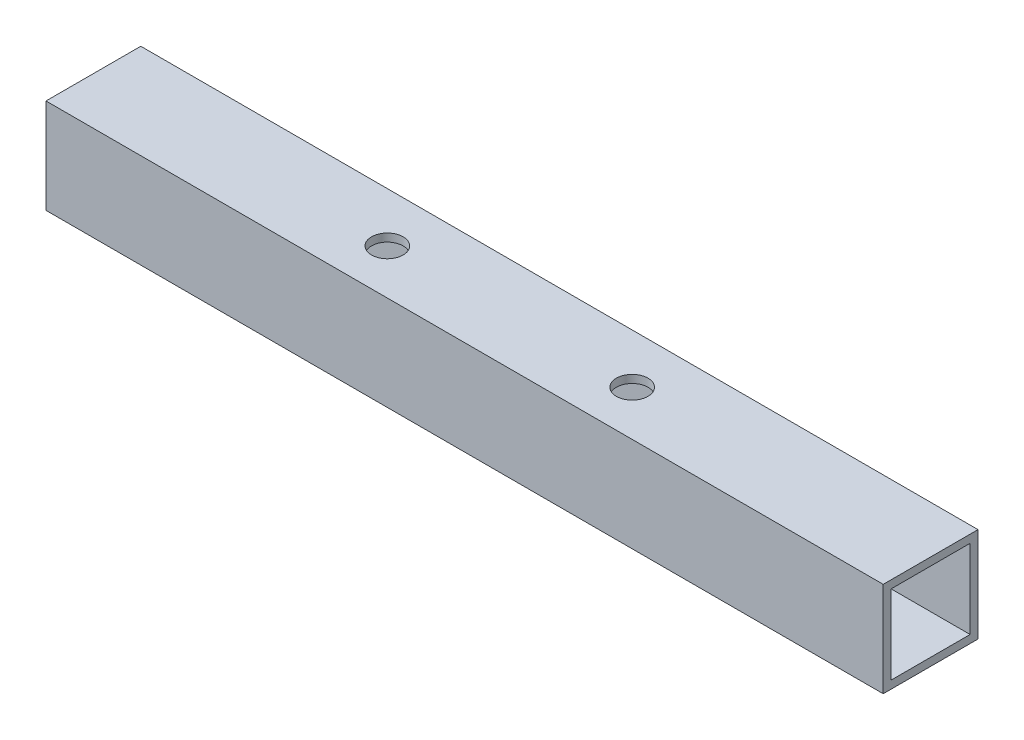
ISO-10303-21;
HEADER;
FILE_DESCRIPTION(('STEP AP214'),'2;1');
FILE_NAME('part.step','',(''),(''),'','','');
FILE_SCHEMA(('AUTOMOTIVE_DESIGN { 1 0 10303 214 1 1 1 1 }'));
ENDSEC;
DATA;
#1=APPLICATION_CONTEXT('core data for automotive mechanical design processes');
#2=APPLICATION_PROTOCOL_DEFINITION('international standard','automotive_design',2000,#1);
#3=PRODUCT_CONTEXT('',#1,'mechanical');
#4=PRODUCT('Part','Part','',(#3));
#5=PRODUCT_RELATED_PRODUCT_CATEGORY('part','',(#4));
#6=PRODUCT_DEFINITION_FORMATION('','',#4);
#7=PRODUCT_DEFINITION_CONTEXT('part definition',#1,'design');
#8=PRODUCT_DEFINITION('design','',#6,#7);
#9=PRODUCT_DEFINITION_SHAPE('','',#8);
#10=(LENGTH_UNIT() NAMED_UNIT(*) SI_UNIT(.MILLI.,.METRE.));
#11=(NAMED_UNIT(*) PLANE_ANGLE_UNIT() SI_UNIT($,.RADIAN.));
#12=(NAMED_UNIT(*) SI_UNIT($,.STERADIAN.) SOLID_ANGLE_UNIT());
#13=UNCERTAINTY_MEASURE_WITH_UNIT(LENGTH_MEASURE(1.E-05),#10,'distance_accuracy_value','');
#14=(GEOMETRIC_REPRESENTATION_CONTEXT(3) GLOBAL_UNCERTAINTY_ASSIGNED_CONTEXT((#13)) GLOBAL_UNIT_ASSIGNED_CONTEXT((#10,
#11,#12)) REPRESENTATION_CONTEXT('',''));
#15=CARTESIAN_POINT('',(0.,0.,0.));
#16=DIRECTION('',(0.,0.,1.));
#17=DIRECTION('',(1.,0.,0.));
#18=AXIS2_PLACEMENT_3D('',#15,#16,#17);
#19=CARTESIAN_POINT('',(15.5,-6.,6.2822585705839));
#20=DIRECTION('',(0.,1.,0.));
#21=DIRECTION('',(0.,0.,1.));
#22=AXIS2_PLACEMENT_3D('',#19,#20,#21);
#23=CYLINDRICAL_SURFACE('',#22,2.);
#24=CARTESIAN_POINT('',(15.5,-5.,6.2822585705839));
#25=DIRECTION('',(0.,-1.,0.));
#26=DIRECTION('',(0.,0.,-1.));
#27=AXIS2_PLACEMENT_3D('',#24,#25,#26);
#28=CIRCLE('',#27,2.);
#29=CARTESIAN_POINT('',(15.5,-5.,4.2822585705839));
#30=VERTEX_POINT('',#29);
#31=EDGE_CURVE('E136',#30,#30,#28,.F.);
#32=ORIENTED_EDGE('',*,*,#31,.T.);
#33=EDGE_LOOP('',(#32));
#34=FACE_BOUND('',#33,.T.);
#35=CARTESIAN_POINT('',(15.5,-6.,6.2822585705839));
#36=DIRECTION('',(0.,1.,0.));
#37=DIRECTION('',(0.,0.,-1.));
#38=AXIS2_PLACEMENT_3D('',#35,#36,#37);
#39=CIRCLE('',#38,2.);
#40=CARTESIAN_POINT('',(15.5,-6.,4.2822585705839));
#41=VERTEX_POINT('',#40);
#42=EDGE_CURVE('E150',#41,#41,#39,.T.);
#43=ORIENTED_EDGE('',*,*,#42,.F.);
#44=EDGE_LOOP('',(#43));
#45=FACE_BOUND('',#44,.T.);
#46=ADVANCED_FACE('F38',(#34,#45),#23,.F.);
#47=CARTESIAN_POINT('',(-15.5,-6.,6.2822585705839));
#48=DIRECTION('',(0.,1.,0.));
#49=DIRECTION('',(0.,0.,1.));
#50=AXIS2_PLACEMENT_3D('',#47,#48,#49);
#51=CYLINDRICAL_SURFACE('',#50,2.);
#52=CARTESIAN_POINT('',(-15.5,-5.,6.2822585705839));
#53=DIRECTION('',(0.,-1.,0.));
#54=DIRECTION('',(0.,0.,-1.));
#55=AXIS2_PLACEMENT_3D('',#52,#53,#54);
#56=CIRCLE('',#55,2.);
#57=CARTESIAN_POINT('',(-15.5,-5.,4.2822585705839));
#58=VERTEX_POINT('',#57);
#59=EDGE_CURVE('E135',#58,#58,#56,.F.);
#60=ORIENTED_EDGE('',*,*,#59,.T.);
#61=EDGE_LOOP('',(#60));
#62=FACE_BOUND('',#61,.T.);
#63=CARTESIAN_POINT('',(-15.5,-6.,6.2822585705839));
#64=DIRECTION('',(0.,1.,0.));
#65=DIRECTION('',(0.,0.,1.));
#66=AXIS2_PLACEMENT_3D('',#63,#64,#65);
#67=CIRCLE('',#66,2.);
#68=CARTESIAN_POINT('',(-15.5,-6.,8.2822585705839));
#69=VERTEX_POINT('',#68);
#70=EDGE_CURVE('E143',#69,#69,#67,.T.);
#71=ORIENTED_EDGE('',*,*,#70,.F.);
#72=EDGE_LOOP('',(#71));
#73=FACE_BOUND('',#72,.T.);
#74=ADVANCED_FACE('F207',(#62,#73),#51,.F.);
#75=CARTESIAN_POINT('',(53.,-6.,12.));
#76=DIRECTION('',(-1.,0.,0.));
#77=DIRECTION('',(0.,0.,1.));
#78=AXIS2_PLACEMENT_3D('',#75,#76,#77);
#79=PLANE('',#78);
#80=DIRECTION('',(0.,0.,1.));
#81=VECTOR('',#80,1.);
#82=CARTESIAN_POINT('',(53.,5.,11.));
#83=LINE('',#82,#81);
#84=CARTESIAN_POINT('',(53.,5.,1.));
#85=VERTEX_POINT('',#84);
#86=CARTESIAN_POINT('',(53.,5.,11.));
#87=VERTEX_POINT('',#86);
#88=EDGE_CURVE('E114',#85,#87,#83,.T.);
#89=ORIENTED_EDGE('',*,*,#88,.F.);
#90=DIRECTION('',(0.,1.,0.));
#91=VECTOR('',#90,1.);
#92=CARTESIAN_POINT('',(53.,5.,1.));
#93=LINE('',#92,#91);
#94=CARTESIAN_POINT('',(53.,-5.,0.999999999999997));
#95=VERTEX_POINT('',#94);
#96=EDGE_CURVE('E53',#95,#85,#93,.T.);
#97=ORIENTED_EDGE('',*,*,#96,.F.);
#98=DIRECTION('',(0.,0.,-1.));
#99=VECTOR('',#98,1.);
#100=CARTESIAN_POINT('',(53.,-5.,11.));
#101=LINE('',#100,#99);
#102=CARTESIAN_POINT('',(53.,-5.,11.));
#103=VERTEX_POINT('',#102);
#104=EDGE_CURVE('E120',#103,#95,#101,.T.);
#105=ORIENTED_EDGE('',*,*,#104,.F.);
#106=DIRECTION('',(0.,-1.,0.));
#107=VECTOR('',#106,1.);
#108=CARTESIAN_POINT('',(53.,5.,11.));
#109=LINE('',#108,#107);
#110=EDGE_CURVE('E106',#87,#103,#109,.T.);
#111=ORIENTED_EDGE('',*,*,#110,.F.);
#112=EDGE_LOOP('',(#89,#97,#105,#111));
#113=FACE_BOUND('',#112,.T.);
#114=DIRECTION('',(0.,1.,0.));
#115=VECTOR('',#114,1.);
#116=CARTESIAN_POINT('',(53.,-6.,0.));
#117=LINE('',#116,#115);
#118=CARTESIAN_POINT('',(53.,-6.,0.));
#119=VERTEX_POINT('',#118);
#120=CARTESIAN_POINT('',(53.,6.,0.));
#121=VERTEX_POINT('',#120);
#122=EDGE_CURVE('E146',#119,#121,#117,.T.);
#123=ORIENTED_EDGE('',*,*,#122,.T.);
#124=DIRECTION('',(0.,0.,-1.));
#125=VECTOR('',#124,1.);
#126=CARTESIAN_POINT('',(53.,6.,12.));
#127=LINE('',#126,#125);
#128=CARTESIAN_POINT('',(53.,6.,12.));
#129=VERTEX_POINT('',#128);
#130=EDGE_CURVE('E181',#129,#121,#127,.T.);
#131=ORIENTED_EDGE('',*,*,#130,.F.);
#132=DIRECTION('',(0.,1.,0.));
#133=VECTOR('',#132,1.);
#134=CARTESIAN_POINT('',(53.,-6.,12.));
#135=LINE('',#134,#133);
#136=CARTESIAN_POINT('',(53.,-6.,12.));
#137=VERTEX_POINT('',#136);
#138=EDGE_CURVE('E155',#137,#129,#135,.T.);
#139=ORIENTED_EDGE('',*,*,#138,.F.);
#140=DIRECTION('',(0.,0.,-1.));
#141=VECTOR('',#140,1.);
#142=CARTESIAN_POINT('',(53.,-6.,12.));
#143=LINE('',#142,#141);
#144=EDGE_CURVE('E165',#137,#119,#143,.T.);
#145=ORIENTED_EDGE('',*,*,#144,.T.);
#146=EDGE_LOOP('',(#123,#131,#139,#145));
#147=FACE_BOUND('',#146,.T.);
#148=ADVANCED_FACE('F40',(#113,#147),#79,.F.);
#149=CARTESIAN_POINT('',(-53.,6.,12.));
#150=DIRECTION('',(0.,-1.,0.));
#151=DIRECTION('',(0.,0.,-1.));
#152=AXIS2_PLACEMENT_3D('',#149,#150,#151);
#153=PLANE('',#152);
#154=CARTESIAN_POINT('',(-15.5,6.,6.2822585705839));
#155=DIRECTION('',(0.,1.,0.));
#156=DIRECTION('',(0.,0.,1.));
#157=AXIS2_PLACEMENT_3D('',#154,#155,#156);
#158=CIRCLE('',#157,2.);
#159=CARTESIAN_POINT('',(-15.5,6.,8.2822585705839));
#160=VERTEX_POINT('',#159);
#161=EDGE_CURVE('E147',#160,#160,#158,.T.);
#162=ORIENTED_EDGE('',*,*,#161,.F.);
#163=EDGE_LOOP('',(#162));
#164=FACE_BOUND('',#163,.T.);
#165=CARTESIAN_POINT('',(15.5,6.,6.2822585705839));
#166=DIRECTION('',(0.,1.,0.));
#167=DIRECTION('',(0.,0.,-1.));
#168=AXIS2_PLACEMENT_3D('',#165,#166,#167);
#169=CIRCLE('',#168,2.);
#170=CARTESIAN_POINT('',(15.5,6.,4.2822585705839));
#171=VERTEX_POINT('',#170);
#172=EDGE_CURVE('E142',#171,#171,#169,.T.);
#173=ORIENTED_EDGE('',*,*,#172,.F.);
#174=EDGE_LOOP('',(#173));
#175=FACE_BOUND('',#174,.T.);
#176=DIRECTION('',(-1.,0.,0.));
#177=VECTOR('',#176,1.);
#178=CARTESIAN_POINT('',(-53.,6.,0.));
#179=LINE('',#178,#177);
#180=CARTESIAN_POINT('',(-53.,6.,0.));
#181=VERTEX_POINT('',#180);
#182=EDGE_CURVE('E168',#121,#181,#179,.T.);
#183=ORIENTED_EDGE('',*,*,#182,.T.);
#184=DIRECTION('',(0.,0.,-1.));
#185=VECTOR('',#184,1.);
#186=CARTESIAN_POINT('',(-53.,6.,12.));
#187=LINE('',#186,#185);
#188=CARTESIAN_POINT('',(-53.,6.,12.));
#189=VERTEX_POINT('',#188);
#190=EDGE_CURVE('E178',#189,#181,#187,.T.);
#191=ORIENTED_EDGE('',*,*,#190,.F.);
#192=DIRECTION('',(-1.,0.,0.));
#193=VECTOR('',#192,1.);
#194=CARTESIAN_POINT('',(-53.,6.,12.));
#195=LINE('',#194,#193);
#196=EDGE_CURVE('E158',#129,#189,#195,.T.);
#197=ORIENTED_EDGE('',*,*,#196,.F.);
#198=ORIENTED_EDGE('',*,*,#130,.T.);
#199=EDGE_LOOP('',(#183,#191,#197,#198));
#200=FACE_BOUND('',#199,.T.);
#201=ADVANCED_FACE('F234',(#164,#175,#200),#153,.F.);
#202=CARTESIAN_POINT('',(-53.,-6.,12.));
#203=DIRECTION('',(1.,0.,0.));
#204=DIRECTION('',(0.,0.,-1.));
#205=AXIS2_PLACEMENT_3D('',#202,#203,#204);
#206=PLANE('',#205);
#207=DIRECTION('',(0.,0.,-1.));
#208=VECTOR('',#207,1.);
#209=CARTESIAN_POINT('',(-53.,-5.,12.));
#210=LINE('',#209,#208);
#211=CARTESIAN_POINT('',(-53.,-5.,11.));
#212=VERTEX_POINT('',#211);
#213=CARTESIAN_POINT('',(-53.,-5.,0.999999999999997));
#214=VERTEX_POINT('',#213);
#215=EDGE_CURVE('E139',#212,#214,#210,.T.);
#216=ORIENTED_EDGE('',*,*,#215,.T.);
#217=DIRECTION('',(0.,1.,0.));
#218=VECTOR('',#217,1.);
#219=CARTESIAN_POINT('',(-53.,-6.,0.999999999999997));
#220=LINE('',#219,#218);
#221=CARTESIAN_POINT('',(-53.,5.,1.));
#222=VERTEX_POINT('',#221);
#223=EDGE_CURVE('E11',#214,#222,#220,.T.);
#224=ORIENTED_EDGE('',*,*,#223,.T.);
#225=DIRECTION('',(0.,0.,1.));
#226=VECTOR('',#225,1.);
#227=CARTESIAN_POINT('',(-53.,5.,12.));
#228=LINE('',#227,#226);
#229=CARTESIAN_POINT('',(-53.,5.,11.));
#230=VERTEX_POINT('',#229);
#231=EDGE_CURVE('E133',#222,#230,#228,.T.);
#232=ORIENTED_EDGE('',*,*,#231,.T.);
#233=DIRECTION('',(0.,-1.,0.));
#234=VECTOR('',#233,1.);
#235=CARTESIAN_POINT('',(-53.,-6.,11.));
#236=LINE('',#235,#234);
#237=EDGE_CURVE('E46',#230,#212,#236,.T.);
#238=ORIENTED_EDGE('',*,*,#237,.T.);
#239=EDGE_LOOP('',(#216,#224,#232,#238));
#240=FACE_BOUND('',#239,.T.);
#241=DIRECTION('',(0.,-1.,0.));
#242=VECTOR('',#241,1.);
#243=CARTESIAN_POINT('',(-53.,-6.,0.));
#244=LINE('',#243,#242);
#245=CARTESIAN_POINT('',(-53.,-6.,0.));
#246=VERTEX_POINT('',#245);
#247=EDGE_CURVE('E170',#181,#246,#244,.T.);
#248=ORIENTED_EDGE('',*,*,#247,.T.);
#249=DIRECTION('',(0.,0.,-1.));
#250=VECTOR('',#249,1.);
#251=CARTESIAN_POINT('',(-53.,-6.,12.));
#252=LINE('',#251,#250);
#253=CARTESIAN_POINT('',(-53.,-6.,12.));
#254=VERTEX_POINT('',#253);
#255=EDGE_CURVE('E175',#254,#246,#252,.T.);
#256=ORIENTED_EDGE('',*,*,#255,.F.);
#257=DIRECTION('',(0.,-1.,0.));
#258=VECTOR('',#257,1.);
#259=CARTESIAN_POINT('',(-53.,-6.,12.));
#260=LINE('',#259,#258);
#261=EDGE_CURVE('E161',#189,#254,#260,.T.);
#262=ORIENTED_EDGE('',*,*,#261,.F.);
#263=ORIENTED_EDGE('',*,*,#190,.T.);
#264=EDGE_LOOP('',(#248,#256,#262,#263));
#265=FACE_BOUND('',#264,.T.);
#266=ADVANCED_FACE('F188',(#240,#265),#206,.F.);
#267=CARTESIAN_POINT('',(-53.,-6.,12.));
#268=DIRECTION('',(0.,1.,0.));
#269=DIRECTION('',(0.,0.,1.));
#270=AXIS2_PLACEMENT_3D('',#267,#268,#269);
#271=PLANE('',#270);
#272=ORIENTED_EDGE('',*,*,#70,.T.);
#273=EDGE_LOOP('',(#272));
#274=FACE_BOUND('',#273,.T.);
#275=ORIENTED_EDGE('',*,*,#42,.T.);
#276=EDGE_LOOP('',(#275));
#277=FACE_BOUND('',#276,.T.);
#278=DIRECTION('',(1.,0.,0.));
#279=VECTOR('',#278,1.);
#280=CARTESIAN_POINT('',(-53.,-6.,0.));
#281=LINE('',#280,#279);
#282=EDGE_CURVE('E159',#246,#119,#281,.T.);
#283=ORIENTED_EDGE('',*,*,#282,.T.);
#284=ORIENTED_EDGE('',*,*,#144,.F.);
#285=DIRECTION('',(1.,0.,0.));
#286=VECTOR('',#285,1.);
#287=CARTESIAN_POINT('',(-53.,-6.,12.));
#288=LINE('',#287,#286);
#289=EDGE_CURVE('E163',#254,#137,#288,.T.);
#290=ORIENTED_EDGE('',*,*,#289,.F.);
#291=ORIENTED_EDGE('',*,*,#255,.T.);
#292=EDGE_LOOP('',(#283,#284,#290,#291));
#293=FACE_BOUND('',#292,.T.);
#294=ADVANCED_FACE('F247',(#274,#277,#293),#271,.F.);
#295=CARTESIAN_POINT('',(0.,0.,12.));
#296=DIRECTION('',(0.,0.,-1.));
#297=DIRECTION('',(-1.,0.,0.));
#298=AXIS2_PLACEMENT_3D('',#295,#296,#297);
#299=PLANE('',#298);
#300=ORIENTED_EDGE('',*,*,#138,.T.);
#301=ORIENTED_EDGE('',*,*,#196,.T.);
#302=ORIENTED_EDGE('',*,*,#261,.T.);
#303=ORIENTED_EDGE('',*,*,#289,.T.);
#304=EDGE_LOOP('',(#300,#301,#302,#303));
#305=FACE_BOUND('',#304,.T.);
#306=ADVANCED_FACE('F227',(#305),#299,.F.);
#307=CARTESIAN_POINT('',(0.,0.,0.));
#308=DIRECTION('',(0.,0.,-1.));
#309=DIRECTION('',(-1.,0.,0.));
#310=AXIS2_PLACEMENT_3D('',#307,#308,#309);
#311=PLANE('',#310);
#312=ORIENTED_EDGE('',*,*,#122,.F.);
#313=ORIENTED_EDGE('',*,*,#282,.F.);
#314=ORIENTED_EDGE('',*,*,#247,.F.);
#315=ORIENTED_EDGE('',*,*,#182,.F.);
#316=EDGE_LOOP('',(#312,#313,#314,#315));
#317=FACE_BOUND('',#316,.T.);
#318=ADVANCED_FACE('F220',(#317),#311,.T.);
#319=CARTESIAN_POINT('',(15.5,5.,6.2822585705839));
#320=DIRECTION('',(0.,1.,0.));
#321=DIRECTION('',(0.,0.,1.));
#322=AXIS2_PLACEMENT_3D('',#319,#320,#321);
#323=CIRCLE('',#322,2.);
#324=CARTESIAN_POINT('',(15.5,5.,8.2822585705839));
#325=VERTEX_POINT('',#324);
#326=EDGE_CURVE('E130',#325,#325,#323,.F.);
#327=ORIENTED_EDGE('',*,*,#326,.T.);
#328=EDGE_LOOP('',(#327));
#329=FACE_BOUND('',#328,.T.);
#330=ORIENTED_EDGE('',*,*,#172,.T.);
#331=EDGE_LOOP('',(#330));
#332=FACE_BOUND('',#331,.T.);
#333=ADVANCED_FACE('F210',(#329,#332),#23,.F.);
#334=CARTESIAN_POINT('',(-15.5,5.,6.2822585705839));
#335=DIRECTION('',(0.,1.,0.));
#336=DIRECTION('',(0.,0.,1.));
#337=AXIS2_PLACEMENT_3D('',#334,#335,#336);
#338=CIRCLE('',#337,2.);
#339=CARTESIAN_POINT('',(-15.5,5.,8.2822585705839));
#340=VERTEX_POINT('',#339);
#341=EDGE_CURVE('E127',#340,#340,#338,.F.);
#342=ORIENTED_EDGE('',*,*,#341,.T.);
#343=EDGE_LOOP('',(#342));
#344=FACE_BOUND('',#343,.T.);
#345=ORIENTED_EDGE('',*,*,#161,.T.);
#346=EDGE_LOOP('',(#345));
#347=FACE_BOUND('',#346,.T.);
#348=ADVANCED_FACE('F216',(#344,#347),#51,.F.);
#349=CARTESIAN_POINT('',(-75.,5.,1.));
#350=DIRECTION('',(0.,0.,-1.));
#351=DIRECTION('',(0.,1.,0.));
#352=AXIS2_PLACEMENT_3D('',#349,#350,#351);
#353=PLANE('',#352);
#354=DIRECTION('',(1.,0.,0.));
#355=VECTOR('',#354,1.);
#356=CARTESIAN_POINT('',(-75.,-5.,0.999999999999997));
#357=LINE('',#356,#355);
#358=EDGE_CURVE('E125',#214,#95,#357,.T.);
#359=ORIENTED_EDGE('',*,*,#358,.T.);
#360=ORIENTED_EDGE('',*,*,#96,.T.);
#361=DIRECTION('',(1.,0.,0.));
#362=VECTOR('',#361,1.);
#363=CARTESIAN_POINT('',(-75.,5.,1.));
#364=LINE('',#363,#362);
#365=EDGE_CURVE('E111',#222,#85,#364,.T.);
#366=ORIENTED_EDGE('',*,*,#365,.F.);
#367=ORIENTED_EDGE('',*,*,#223,.F.);
#368=EDGE_LOOP('',(#359,#360,#366,#367));
#369=FACE_BOUND('',#368,.T.);
#370=ADVANCED_FACE('F190',(#369),#353,.F.);
#371=CARTESIAN_POINT('',(-75.,5.,11.));
#372=DIRECTION('',(0.,0.,1.));
#373=DIRECTION('',(0.,-1.,0.));
#374=AXIS2_PLACEMENT_3D('',#371,#372,#373);
#375=PLANE('',#374);
#376=DIRECTION('',(1.,0.,0.));
#377=VECTOR('',#376,1.);
#378=CARTESIAN_POINT('',(-75.,5.,11.));
#379=LINE('',#378,#377);
#380=EDGE_CURVE('E61',#230,#87,#379,.T.);
#381=ORIENTED_EDGE('',*,*,#380,.T.);
#382=ORIENTED_EDGE('',*,*,#110,.T.);
#383=DIRECTION('',(1.,0.,0.));
#384=VECTOR('',#383,1.);
#385=CARTESIAN_POINT('',(-75.,-5.,11.));
#386=LINE('',#385,#384);
#387=EDGE_CURVE('E110',#212,#103,#386,.T.);
#388=ORIENTED_EDGE('',*,*,#387,.F.);
#389=ORIENTED_EDGE('',*,*,#237,.F.);
#390=EDGE_LOOP('',(#381,#382,#388,#389));
#391=FACE_BOUND('',#390,.T.);
#392=ADVANCED_FACE('F103',(#391),#375,.F.);
#393=CARTESIAN_POINT('',(-75.,-5.,11.));
#394=DIRECTION('',(0.,-1.,0.));
#395=DIRECTION('',(0.,0.,-1.));
#396=AXIS2_PLACEMENT_3D('',#393,#394,#395);
#397=PLANE('',#396);
#398=ORIENTED_EDGE('',*,*,#59,.F.);
#399=EDGE_LOOP('',(#398));
#400=FACE_BOUND('',#399,.T.);
#401=ORIENTED_EDGE('',*,*,#31,.F.);
#402=EDGE_LOOP('',(#401));
#403=FACE_BOUND('',#402,.T.);
#404=ORIENTED_EDGE('',*,*,#387,.T.);
#405=ORIENTED_EDGE('',*,*,#104,.T.);
#406=ORIENTED_EDGE('',*,*,#358,.F.);
#407=ORIENTED_EDGE('',*,*,#215,.F.);
#408=EDGE_LOOP('',(#404,#405,#406,#407));
#409=FACE_BOUND('',#408,.T.);
#410=ADVANCED_FACE('F193',(#400,#403,#409),#397,.F.);
#411=CARTESIAN_POINT('',(-75.,5.,11.));
#412=DIRECTION('',(0.,1.,0.));
#413=DIRECTION('',(0.,0.,1.));
#414=AXIS2_PLACEMENT_3D('',#411,#412,#413);
#415=PLANE('',#414);
#416=ORIENTED_EDGE('',*,*,#341,.F.);
#417=EDGE_LOOP('',(#416));
#418=FACE_BOUND('',#417,.T.);
#419=ORIENTED_EDGE('',*,*,#326,.F.);
#420=EDGE_LOOP('',(#419));
#421=FACE_BOUND('',#420,.T.);
#422=ORIENTED_EDGE('',*,*,#365,.T.);
#423=ORIENTED_EDGE('',*,*,#88,.T.);
#424=ORIENTED_EDGE('',*,*,#380,.F.);
#425=ORIENTED_EDGE('',*,*,#231,.F.);
#426=EDGE_LOOP('',(#422,#423,#424,#425));
#427=FACE_BOUND('',#426,.T.);
#428=ADVANCED_FACE('F115',(#418,#421,#427),#415,.F.);
#429=CLOSED_SHELL('',(#46,#74,#148,#201,#266,#294,#306,#318,#333,#348,#370,#392,#410,#428));
#430=MANIFOLD_SOLID_BREP('B2',#429);
#431=ADVANCED_BREP_SHAPE_REPRESENTATION('',(#18,#430),#14);
#432=SHAPE_DEFINITION_REPRESENTATION(#9,#431);
ENDSEC;
END-ISO-10303-21;
